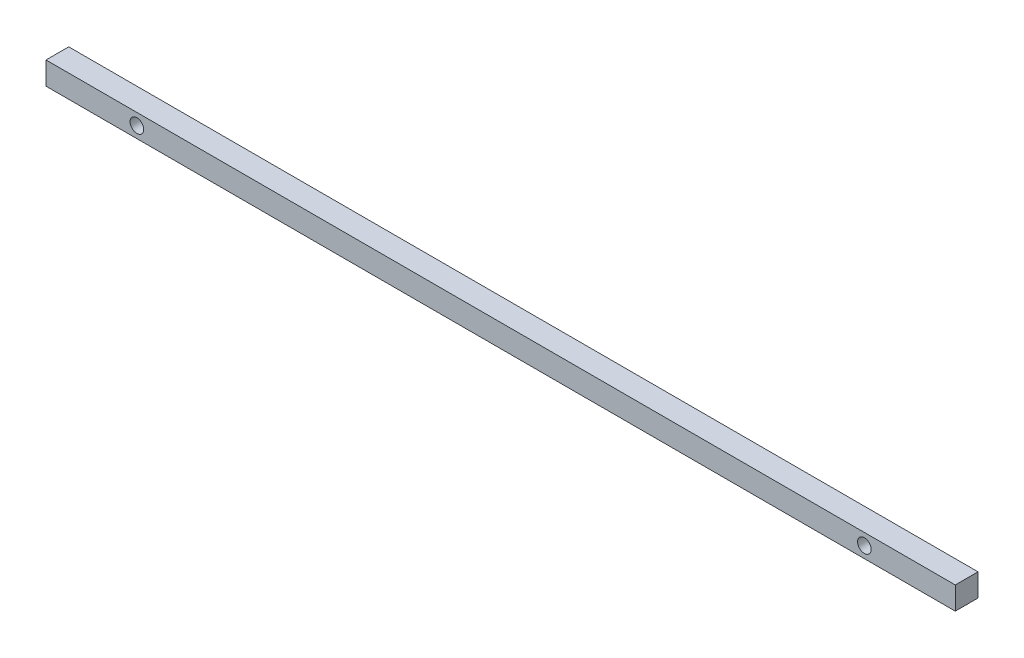
ISO-10303-21;
HEADER;
FILE_DESCRIPTION(('STEP AP214'),'2;1');
FILE_NAME('part.step','',(''),(''),'','','');
FILE_SCHEMA(('AUTOMOTIVE_DESIGN { 1 0 10303 214 1 1 1 1 }'));
ENDSEC;
DATA;
#1=APPLICATION_CONTEXT('core data for automotive mechanical design processes');
#2=APPLICATION_PROTOCOL_DEFINITION('international standard','automotive_design',2000,#1);
#3=PRODUCT_CONTEXT('',#1,'mechanical');
#4=PRODUCT('Part','Part','',(#3));
#5=PRODUCT_RELATED_PRODUCT_CATEGORY('part','',(#4));
#6=PRODUCT_DEFINITION_FORMATION('','',#4);
#7=PRODUCT_DEFINITION_CONTEXT('part definition',#1,'design');
#8=PRODUCT_DEFINITION('design','',#6,#7);
#9=PRODUCT_DEFINITION_SHAPE('','',#8);
#10=(LENGTH_UNIT() NAMED_UNIT(*) SI_UNIT(.MILLI.,.METRE.));
#11=(NAMED_UNIT(*) PLANE_ANGLE_UNIT() SI_UNIT($,.RADIAN.));
#12=(NAMED_UNIT(*) SI_UNIT($,.STERADIAN.) SOLID_ANGLE_UNIT());
#13=UNCERTAINTY_MEASURE_WITH_UNIT(LENGTH_MEASURE(1.E-05),#10,'distance_accuracy_value','');
#14=(GEOMETRIC_REPRESENTATION_CONTEXT(3) GLOBAL_UNCERTAINTY_ASSIGNED_CONTEXT((#13)) GLOBAL_UNIT_ASSIGNED_CONTEXT((#10,
#11,#12)) REPRESENTATION_CONTEXT('',''));
#15=CARTESIAN_POINT('',(0.,0.,0.));
#16=DIRECTION('',(0.,0.,1.));
#17=DIRECTION('',(1.,0.,0.));
#18=AXIS2_PLACEMENT_3D('',#15,#16,#17);
#19=CARTESIAN_POINT('',(0.,0.,10.));
#20=DIRECTION('',(0.,0.,-1.));
#21=DIRECTION('',(-1.,0.,0.));
#22=AXIS2_PLACEMENT_3D('',#19,#20,#21);
#23=PLANE('',#22);
#24=DIRECTION('',(1.,0.,0.));
#25=VECTOR('',#24,1.);
#26=CARTESIAN_POINT('',(400.,0.,10.));
#27=LINE('',#26,#25);
#28=CARTESIAN_POINT('',(0.,0.,10.));
#29=VERTEX_POINT('',#28);
#30=CARTESIAN_POINT('',(400.,0.,10.));
#31=VERTEX_POINT('',#30);
#32=EDGE_CURVE('E89',#29,#31,#27,.T.);
#33=ORIENTED_EDGE('',*,*,#32,.T.);
#34=DIRECTION('',(0.,1.,0.));
#35=VECTOR('',#34,1.);
#36=CARTESIAN_POINT('',(400.,10.,10.));
#37=LINE('',#36,#35);
#38=CARTESIAN_POINT('',(400.,10.,10.));
#39=VERTEX_POINT('',#38);
#40=EDGE_CURVE('E84',#31,#39,#37,.T.);
#41=ORIENTED_EDGE('',*,*,#40,.T.);
#42=DIRECTION('',(-1.,0.,0.));
#43=VECTOR('',#42,1.);
#44=CARTESIAN_POINT('',(0.,10.0000000000001,10.));
#45=LINE('',#44,#43);
#46=CARTESIAN_POINT('',(0.,10.0000000000001,10.));
#47=VERTEX_POINT('',#46);
#48=EDGE_CURVE('E87',#39,#47,#45,.T.);
#49=ORIENTED_EDGE('',*,*,#48,.T.);
#50=DIRECTION('',(0.,-1.,0.));
#51=VECTOR('',#50,1.);
#52=CARTESIAN_POINT('',(0.,0.,10.));
#53=LINE('',#52,#51);
#54=EDGE_CURVE('E54',#47,#29,#53,.T.);
#55=ORIENTED_EDGE('',*,*,#54,.T.);
#56=EDGE_LOOP('',(#33,#41,#49,#55));
#57=FACE_BOUND('',#56,.T.);
#58=CARTESIAN_POINT('',(40.,5.00000000000005,10.));
#59=DIRECTION('',(0.,0.,1.));
#60=DIRECTION('',(1.,0.,0.));
#61=AXIS2_PLACEMENT_3D('',#58,#59,#60);
#62=CIRCLE('',#61,2.99999999999999);
#63=CARTESIAN_POINT('',(43.,5.00000000000005,10.));
#64=VERTEX_POINT('',#63);
#65=EDGE_CURVE('E104',#64,#64,#62,.T.);
#66=ORIENTED_EDGE('',*,*,#65,.F.);
#67=EDGE_LOOP('',(#66));
#68=FACE_BOUND('',#67,.T.);
#69=CARTESIAN_POINT('',(360.,5.00000000000005,10.));
#70=DIRECTION('',(0.,0.,1.));
#71=DIRECTION('',(1.,0.,0.));
#72=AXIS2_PLACEMENT_3D('',#69,#70,#71);
#73=CIRCLE('',#72,2.99999999999999);
#74=CARTESIAN_POINT('',(363.,5.00000000000005,10.));
#75=VERTEX_POINT('',#74);
#76=EDGE_CURVE('E119',#75,#75,#73,.T.);
#77=ORIENTED_EDGE('',*,*,#76,.F.);
#78=EDGE_LOOP('',(#77));
#79=FACE_BOUND('',#78,.T.);
#80=ADVANCED_FACE('F37',(#57,#68,#79),#23,.F.);
#81=CARTESIAN_POINT('',(0.,0.,0.));
#82=DIRECTION('',(0.,0.,-1.));
#83=DIRECTION('',(-1.,0.,0.));
#84=AXIS2_PLACEMENT_3D('',#81,#82,#83);
#85=PLANE('',#84);
#86=CARTESIAN_POINT('',(40.,5.00000000000005,0.));
#87=DIRECTION('',(0.,0.,1.));
#88=DIRECTION('',(1.,0.,0.));
#89=AXIS2_PLACEMENT_3D('',#86,#87,#88);
#90=CIRCLE('',#89,2.99999999999999);
#91=CARTESIAN_POINT('',(43.,5.00000000000005,0.));
#92=VERTEX_POINT('',#91);
#93=EDGE_CURVE('E116',#92,#92,#90,.T.);
#94=ORIENTED_EDGE('',*,*,#93,.T.);
#95=EDGE_LOOP('',(#94));
#96=FACE_BOUND('',#95,.T.);
#97=DIRECTION('',(1.,0.,0.));
#98=VECTOR('',#97,1.);
#99=CARTESIAN_POINT('',(400.,0.,0.));
#100=LINE('',#99,#98);
#101=CARTESIAN_POINT('',(0.,0.,0.));
#102=VERTEX_POINT('',#101);
#103=CARTESIAN_POINT('',(400.,0.,0.));
#104=VERTEX_POINT('',#103);
#105=EDGE_CURVE('E101',#102,#104,#100,.T.);
#106=ORIENTED_EDGE('',*,*,#105,.F.);
#107=DIRECTION('',(0.,-1.,0.));
#108=VECTOR('',#107,1.);
#109=CARTESIAN_POINT('',(0.,0.,0.));
#110=LINE('',#109,#108);
#111=CARTESIAN_POINT('',(0.,10.0000000000001,0.));
#112=VERTEX_POINT('',#111);
#113=EDGE_CURVE('E77',#112,#102,#110,.T.);
#114=ORIENTED_EDGE('',*,*,#113,.F.);
#115=DIRECTION('',(-1.,0.,0.));
#116=VECTOR('',#115,1.);
#117=CARTESIAN_POINT('',(0.,10.0000000000001,0.));
#118=LINE('',#117,#116);
#119=CARTESIAN_POINT('',(400.,10.,0.));
#120=VERTEX_POINT('',#119);
#121=EDGE_CURVE('E71',#120,#112,#118,.T.);
#122=ORIENTED_EDGE('',*,*,#121,.F.);
#123=DIRECTION('',(0.,1.,0.));
#124=VECTOR('',#123,1.);
#125=CARTESIAN_POINT('',(400.,10.,0.));
#126=LINE('',#125,#124);
#127=EDGE_CURVE('E93',#104,#120,#126,.T.);
#128=ORIENTED_EDGE('',*,*,#127,.F.);
#129=EDGE_LOOP('',(#106,#114,#122,#128));
#130=FACE_BOUND('',#129,.T.);
#131=CARTESIAN_POINT('',(360.,5.00000000000005,0.));
#132=DIRECTION('',(0.,0.,1.));
#133=DIRECTION('',(1.,0.,0.));
#134=AXIS2_PLACEMENT_3D('',#131,#132,#133);
#135=CIRCLE('',#134,2.99999999999999);
#136=CARTESIAN_POINT('',(363.,5.00000000000005,0.));
#137=VERTEX_POINT('',#136);
#138=EDGE_CURVE('E122',#137,#137,#135,.T.);
#139=ORIENTED_EDGE('',*,*,#138,.T.);
#140=EDGE_LOOP('',(#139));
#141=FACE_BOUND('',#140,.T.);
#142=ADVANCED_FACE('F112',(#96,#130,#141),#85,.T.);
#143=CARTESIAN_POINT('',(400.,0.,10.));
#144=DIRECTION('',(0.,1.,0.));
#145=DIRECTION('',(-1.,0.,0.));
#146=AXIS2_PLACEMENT_3D('',#143,#144,#145);
#147=PLANE('',#146);
#148=ORIENTED_EDGE('',*,*,#105,.T.);
#149=DIRECTION('',(0.,0.,-1.));
#150=VECTOR('',#149,1.);
#151=CARTESIAN_POINT('',(400.,0.,10.));
#152=LINE('',#151,#150);
#153=EDGE_CURVE('E11',#31,#104,#152,.T.);
#154=ORIENTED_EDGE('',*,*,#153,.F.);
#155=ORIENTED_EDGE('',*,*,#32,.F.);
#156=DIRECTION('',(0.,0.,-1.));
#157=VECTOR('',#156,1.);
#158=CARTESIAN_POINT('',(0.,0.,10.));
#159=LINE('',#158,#157);
#160=EDGE_CURVE('E97',#29,#102,#159,.T.);
#161=ORIENTED_EDGE('',*,*,#160,.T.);
#162=EDGE_LOOP('',(#148,#154,#155,#161));
#163=FACE_BOUND('',#162,.T.);
#164=ADVANCED_FACE('F39',(#163),#147,.F.);
#165=CARTESIAN_POINT('',(400.,10.,10.));
#166=DIRECTION('',(-1.,0.,0.));
#167=DIRECTION('',(0.,0.,1.));
#168=AXIS2_PLACEMENT_3D('',#165,#166,#167);
#169=PLANE('',#168);
#170=ORIENTED_EDGE('',*,*,#127,.T.);
#171=DIRECTION('',(0.,0.,-1.));
#172=VECTOR('',#171,1.);
#173=CARTESIAN_POINT('',(400.,10.,10.));
#174=LINE('',#173,#172);
#175=EDGE_CURVE('E46',#39,#120,#174,.T.);
#176=ORIENTED_EDGE('',*,*,#175,.F.);
#177=ORIENTED_EDGE('',*,*,#40,.F.);
#178=ORIENTED_EDGE('',*,*,#153,.T.);
#179=EDGE_LOOP('',(#170,#176,#177,#178));
#180=FACE_BOUND('',#179,.T.);
#181=ADVANCED_FACE('F92',(#180),#169,.F.);
#182=CARTESIAN_POINT('',(0.,10.0000000000001,10.));
#183=DIRECTION('',(0.,-1.,0.));
#184=DIRECTION('',(1.,0.,0.));
#185=AXIS2_PLACEMENT_3D('',#182,#183,#184);
#186=PLANE('',#185);
#187=ORIENTED_EDGE('',*,*,#121,.T.);
#188=DIRECTION('',(0.,0.,-1.));
#189=VECTOR('',#188,1.);
#190=CARTESIAN_POINT('',(0.,10.0000000000001,10.));
#191=LINE('',#190,#189);
#192=EDGE_CURVE('E94',#47,#112,#191,.T.);
#193=ORIENTED_EDGE('',*,*,#192,.F.);
#194=ORIENTED_EDGE('',*,*,#48,.F.);
#195=ORIENTED_EDGE('',*,*,#175,.T.);
#196=EDGE_LOOP('',(#187,#193,#194,#195));
#197=FACE_BOUND('',#196,.T.);
#198=ADVANCED_FACE('F95',(#197),#186,.F.);
#199=CARTESIAN_POINT('',(0.,0.,10.));
#200=DIRECTION('',(1.,0.,0.));
#201=DIRECTION('',(0.,0.,-1.));
#202=AXIS2_PLACEMENT_3D('',#199,#200,#201);
#203=PLANE('',#202);
#204=ORIENTED_EDGE('',*,*,#113,.T.);
#205=ORIENTED_EDGE('',*,*,#160,.F.);
#206=ORIENTED_EDGE('',*,*,#54,.F.);
#207=ORIENTED_EDGE('',*,*,#192,.T.);
#208=EDGE_LOOP('',(#204,#205,#206,#207));
#209=FACE_BOUND('',#208,.T.);
#210=ADVANCED_FACE('F109',(#209),#203,.F.);
#211=CARTESIAN_POINT('',(40.,5.00000000000005,10.));
#212=DIRECTION('',(0.,0.,-1.));
#213=DIRECTION('',(-1.,0.,0.));
#214=AXIS2_PLACEMENT_3D('',#211,#212,#213);
#215=CYLINDRICAL_SURFACE('',#214,2.99999999999999);
#216=ORIENTED_EDGE('',*,*,#65,.T.);
#217=EDGE_LOOP('',(#216));
#218=FACE_BOUND('',#217,.T.);
#219=ORIENTED_EDGE('',*,*,#93,.F.);
#220=EDGE_LOOP('',(#219));
#221=FACE_BOUND('',#220,.T.);
#222=ADVANCED_FACE('F139',(#218,#221),#215,.F.);
#223=CARTESIAN_POINT('',(360.,5.00000000000005,10.));
#224=DIRECTION('',(0.,0.,-1.));
#225=DIRECTION('',(-1.,0.,0.));
#226=AXIS2_PLACEMENT_3D('',#223,#224,#225);
#227=CYLINDRICAL_SURFACE('',#226,2.99999999999999);
#228=ORIENTED_EDGE('',*,*,#76,.T.);
#229=EDGE_LOOP('',(#228));
#230=FACE_BOUND('',#229,.T.);
#231=ORIENTED_EDGE('',*,*,#138,.F.);
#232=EDGE_LOOP('',(#231));
#233=FACE_BOUND('',#232,.T.);
#234=ADVANCED_FACE('F128',(#230,#233),#227,.F.);
#235=CLOSED_SHELL('',(#80,#142,#164,#181,#198,#210,#222,#234));
#236=MANIFOLD_SOLID_BREP('B2',#235);
#237=ADVANCED_BREP_SHAPE_REPRESENTATION('',(#18,#236),#14);
#238=SHAPE_DEFINITION_REPRESENTATION(#9,#237);
ENDSEC;
END-ISO-10303-21;
